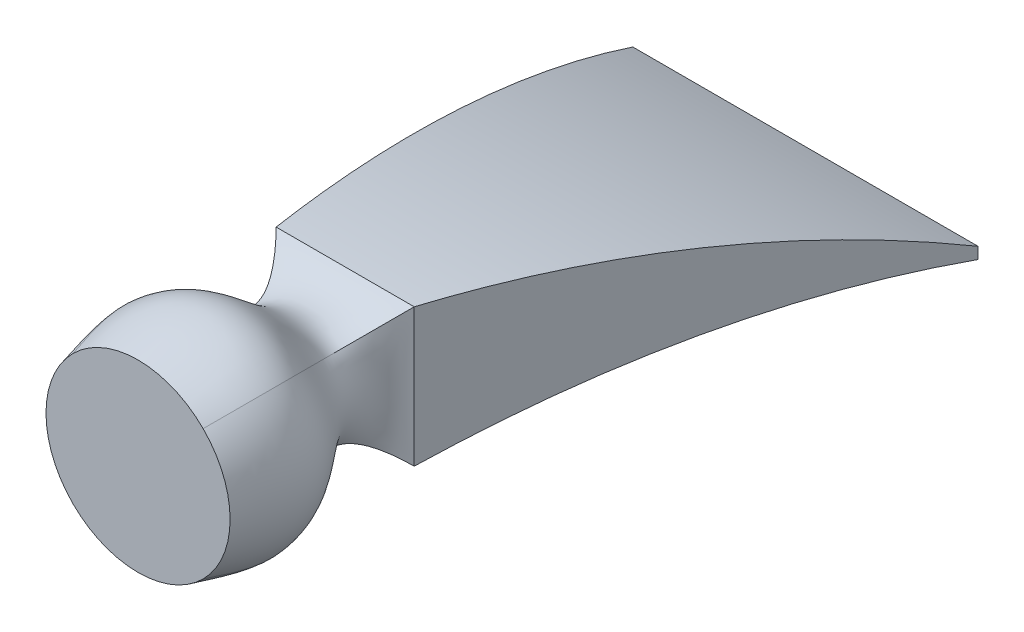
ISO-10303-21;
HEADER;
FILE_DESCRIPTION(('STEP AP214'),'2;1');
FILE_NAME('part.step','',(''),(''),'','','');
FILE_SCHEMA(('AUTOMOTIVE_DESIGN { 1 0 10303 214 1 1 1 1 }'));
ENDSEC;
DATA;
#1=APPLICATION_CONTEXT('core data for automotive mechanical design processes');
#2=APPLICATION_PROTOCOL_DEFINITION('international standard','automotive_design',2000,#1);
#3=PRODUCT_CONTEXT('',#1,'mechanical');
#4=PRODUCT('Part','Part','',(#3));
#5=PRODUCT_RELATED_PRODUCT_CATEGORY('part','',(#4));
#6=PRODUCT_DEFINITION_FORMATION('','',#4);
#7=PRODUCT_DEFINITION_CONTEXT('part definition',#1,'design');
#8=PRODUCT_DEFINITION('design','',#6,#7);
#9=PRODUCT_DEFINITION_SHAPE('','',#8);
#10=(LENGTH_UNIT() NAMED_UNIT(*) SI_UNIT(.MILLI.,.METRE.));
#11=(NAMED_UNIT(*) PLANE_ANGLE_UNIT() SI_UNIT($,.RADIAN.));
#12=(NAMED_UNIT(*) SI_UNIT($,.STERADIAN.) SOLID_ANGLE_UNIT());
#13=UNCERTAINTY_MEASURE_WITH_UNIT(LENGTH_MEASURE(1.E-05),#10,'distance_accuracy_value','');
#14=(GEOMETRIC_REPRESENTATION_CONTEXT(3) GLOBAL_UNCERTAINTY_ASSIGNED_CONTEXT((#13)) GLOBAL_UNIT_ASSIGNED_CONTEXT((#10,
#11,#12)) REPRESENTATION_CONTEXT('',''));
#15=CARTESIAN_POINT('',(0.,0.,0.));
#16=DIRECTION('',(0.,0.,1.));
#17=DIRECTION('',(1.,0.,0.));
#18=AXIS2_PLACEMENT_3D('',#15,#16,#17);
#19=CARTESIAN_POINT('',(0.,0.,304.8));
#20=DIRECTION('',(0.,0.,1.));
#21=DIRECTION('',(1.,0.,0.));
#22=AXIS2_PLACEMENT_3D('',#19,#20,#21);
#23=PLANE('',#22);
#24=CARTESIAN_POINT('',(0.,0.,304.8));
#25=DIRECTION('',(0.,0.,1.));
#26=DIRECTION('',(1.,0.,0.));
#27=AXIS2_PLACEMENT_3D('',#24,#25,#26);
#28=CIRCLE('',#27,12.);
#29=CARTESIAN_POINT('',(-8.48528137423857,-8.48528137423857,304.8));
#30=VERTEX_POINT('',#29);
#31=CARTESIAN_POINT('',(8.48528137423857,-8.48528137423857,304.8));
#32=VERTEX_POINT('',#31);
#33=EDGE_CURVE('E182',#30,#32,#28,.T.);
#34=ORIENTED_EDGE('',*,*,#33,.T.);
#35=CARTESIAN_POINT('',(8.48528137423857,8.48528137423857,304.8));
#36=VERTEX_POINT('',#35);
#37=EDGE_CURVE('E311',#32,#36,#28,.T.);
#38=ORIENTED_EDGE('',*,*,#37,.T.);
#39=CARTESIAN_POINT('',(-8.48528137423857,8.48528137423857,304.8));
#40=VERTEX_POINT('',#39);
#41=EDGE_CURVE('E315',#36,#40,#28,.T.);
#42=ORIENTED_EDGE('',*,*,#41,.T.);
#43=EDGE_CURVE('E303',#40,#30,#28,.T.);
#44=ORIENTED_EDGE('',*,*,#43,.T.);
#45=EDGE_LOOP('',(#34,#38,#42,#44));
#46=FACE_BOUND('',#45,.T.);
#47=ADVANCED_FACE('F154',(#46),#23,.T.);
#48=CARTESIAN_POINT('',(8.48528137423857,8.48528137423857,304.8));
#49=CARTESIAN_POINT('',(9.33473643066399,9.33473643066398,300.561235955056));
#50=CARTESIAN_POINT('',(10.8366753787183,10.8366753787183,293.175792141582));
#51=CARTESIAN_POINT('',(3.45394971686446,3.45394971686446,285.743392235397));
#52=CARTESIAN_POINT('',(6.56267301304578,6.56267301304578,280.274104100236));
#53=CARTESIAN_POINT('',(9.,9.,277.8));
#54=CARTESIAN_POINT('',(13.1684355281017,3.80212722037539,304.8));
#55=CARTESIAN_POINT('',(14.0178905845272,4.08527890585053,300.561235955056));
#56=CARTESIAN_POINT('',(16.2601868037866,4.73985693585621,293.175792141582));
#57=CARTESIAN_POINT('',(7.12312597179714,1.91419499843631,285.743392235397));
#58=CARTESIAN_POINT('',(6.56267301304578,2.18755767101526,280.274104100236));
#59=CARTESIAN_POINT('',(9.,3.,277.8));
#60=CARTESIAN_POINT('',(13.1684355281017,-3.8021272203754,304.8));
#61=CARTESIAN_POINT('',(14.0178905845272,-4.08527890585053,300.561235955056));
#62=CARTESIAN_POINT('',(16.2601868037866,-4.73985693585622,293.175792141582));
#63=CARTESIAN_POINT('',(7.12312597179714,-1.91419499843632,285.743392235397));
#64=CARTESIAN_POINT('',(6.56267301304578,-2.18755767101526,280.274104100236));
#65=CARTESIAN_POINT('',(9.,-3.,277.8));
#66=CARTESIAN_POINT('',(8.48528137423857,-8.48528137423857,304.8));
#67=CARTESIAN_POINT('',(9.33473643066398,-9.33473643066399,300.561235955056));
#68=CARTESIAN_POINT('',(10.8366753787183,-10.8366753787183,293.175792141582));
#69=CARTESIAN_POINT('',(3.45394971686446,-3.45394971686446,285.743392235397));
#70=CARTESIAN_POINT('',(6.56267301304578,-6.56267301304579,280.274104100236));
#71=CARTESIAN_POINT('',(9.,-9.,277.8));
#72=B_SPLINE_SURFACE_WITH_KNOTS('',3,3,((#48,#49,#50,#51,#52,#53),(#54,#55,#56,#57,#58,#59),
(#60,#61,#62,#63,#64,#65),(#66,#67,#68,#69,#70,#71)),.UNSPECIFIED.,.F.,.F.,.F.,(4,4),(4,1,1,4),
(0.,1.),(0.,0.408243982094371,0.714633261667619,1.),.UNSPECIFIED.);
#73=CARTESIAN_POINT('',(8.48528137423857,-8.48528137423857,304.8));
#74=CARTESIAN_POINT('',(9.33473643066398,-9.33473643066399,300.561235955056));
#75=CARTESIAN_POINT('',(10.8366753787183,-10.8366753787183,293.175792141582));
#76=CARTESIAN_POINT('',(3.45394971686446,-3.45394971686446,285.743392235397));
#77=CARTESIAN_POINT('',(6.56267301304578,-6.56267301304579,280.274104100236));
#78=CARTESIAN_POINT('',(9.,-9.,277.8));
#79=B_SPLINE_CURVE_WITH_KNOTS('',3,(#73,#74,#75,#76,#77,#78),.UNSPECIFIED.,.F.,.F.,(4,1,1,4),
(0.,0.408243982094371,0.714633261667619,1.),.UNSPECIFIED.);
#80=CARTESIAN_POINT('',(9.,-9.,277.8));
#81=VERTEX_POINT('',#80);
#82=EDGE_CURVE('E393',#32,#81,#79,.T.);
#83=DIRECTION('',(0.,1.,0.));
#84=VECTOR('',#83,1.);
#85=CARTESIAN_POINT('',(9.,-9.,277.8));
#86=LINE('',#85,#84);
#87=CARTESIAN_POINT('',(9.,9.,277.8));
#88=VERTEX_POINT('',#87);
#89=EDGE_CURVE('E219',#81,#88,#86,.T.);
#90=CARTESIAN_POINT('',(8.48528137423857,8.48528137423857,304.8));
#91=CARTESIAN_POINT('',(9.33473643066399,9.33473643066398,300.561235955056));
#92=CARTESIAN_POINT('',(10.8366753787183,10.8366753787183,293.175792141582));
#93=CARTESIAN_POINT('',(3.45394971686446,3.45394971686446,285.743392235397));
#94=CARTESIAN_POINT('',(6.56267301304578,6.56267301304578,280.274104100236));
#95=CARTESIAN_POINT('',(9.,9.,277.8));
#96=B_SPLINE_CURVE_WITH_KNOTS('',3,(#90,#91,#92,#93,#94,#95),.UNSPECIFIED.,.F.,.F.,(4,1,1,4),
(0.,0.408243982094371,0.714633261667619,1.),.UNSPECIFIED.);
#97=EDGE_CURVE('E380',#88,#36,#96,.F.);
#98=ORIENTED_EDGE('',*,*,#37,.F.);
#99=ORIENTED_EDGE('',*,*,#82,.T.);
#100=ORIENTED_EDGE('',*,*,#89,.T.);
#101=ORIENTED_EDGE('',*,*,#97,.T.);
#102=EDGE_LOOP('',(#98,#99,#100,#101));
#103=FACE_BOUND('',#102,.T.);
#104=ADVANCED_FACE('F333',(#103),#72,.T.);
#105=CARTESIAN_POINT('',(8.48528137423857,-8.48528137423857,304.8));
#106=CARTESIAN_POINT('',(9.33473643066399,-9.33473643066399,300.561235955056));
#107=CARTESIAN_POINT('',(10.8366753787183,-10.8366753787183,293.175792141582));
#108=CARTESIAN_POINT('',(3.45394971686446,-3.45394971686446,285.743392235397));
#109=CARTESIAN_POINT('',(6.56267301304578,-6.56267301304579,280.274104100236));
#110=CARTESIAN_POINT('',(9.,-9.,277.8));
#111=CARTESIAN_POINT('',(3.80212722037539,-13.1684355281017,304.8));
#112=CARTESIAN_POINT('',(4.08527890585053,-14.0178905845272,300.561235955056));
#113=CARTESIAN_POINT('',(4.73985693585622,-16.2601868037866,293.175792141582));
#114=CARTESIAN_POINT('',(1.91419499843631,-7.12312597179714,285.743392235397));
#115=CARTESIAN_POINT('',(2.18755767101526,-6.56267301304578,280.274104100236));
#116=CARTESIAN_POINT('',(3.,-9.,277.8));
#117=CARTESIAN_POINT('',(-3.80212722037539,-13.1684355281017,304.8));
#118=CARTESIAN_POINT('',(-4.08527890585053,-14.0178905845272,300.561235955056));
#119=CARTESIAN_POINT('',(-4.73985693585622,-16.2601868037866,293.175792141582));
#120=CARTESIAN_POINT('',(-1.91419499843632,-7.12312597179714,285.743392235397));
#121=CARTESIAN_POINT('',(-2.18755767101526,-6.56267301304578,280.274104100236));
#122=CARTESIAN_POINT('',(-3.,-9.,277.8));
#123=CARTESIAN_POINT('',(-8.48528137423857,-8.48528137423857,304.8));
#124=CARTESIAN_POINT('',(-9.33473643066399,-9.33473643066399,300.561235955056));
#125=CARTESIAN_POINT('',(-10.8366753787183,-10.8366753787183,293.175792141582));
#126=CARTESIAN_POINT('',(-3.45394971686446,-3.45394971686446,285.743392235397));
#127=CARTESIAN_POINT('',(-6.56267301304578,-6.56267301304578,280.274104100236));
#128=CARTESIAN_POINT('',(-9.,-9.,277.8));
#129=B_SPLINE_SURFACE_WITH_KNOTS('',3,3,((#105,#106,#107,#108,#109,#110),(#111,#112,#113,#114,
#115,#116),(#117,#118,#119,#120,#121,#122),(#123,#124,#125,#126,#127,#128)),.UNSPECIFIED.,.F.,
.F.,.F.,(4,4),(4,1,1,4),(0.,1.),(0.,0.408243982094371,0.714633261667619,1.),.UNSPECIFIED.);
#130=CARTESIAN_POINT('',(-8.48528137423857,-8.48528137423857,304.8));
#131=CARTESIAN_POINT('',(-9.33473643066399,-9.33473643066399,300.561235955056));
#132=CARTESIAN_POINT('',(-10.8366753787183,-10.8366753787183,293.175792141582));
#133=CARTESIAN_POINT('',(-3.45394971686446,-3.45394971686446,285.743392235397));
#134=CARTESIAN_POINT('',(-6.56267301304578,-6.56267301304578,280.274104100236));
#135=CARTESIAN_POINT('',(-9.,-9.,277.8));
#136=B_SPLINE_CURVE_WITH_KNOTS('',3,(#130,#131,#132,#133,#134,#135),.UNSPECIFIED.,.F.,.F.,(4,1,
1,4),(0.,0.408243982094371,0.714633261667619,1.),.UNSPECIFIED.);
#137=CARTESIAN_POINT('',(-9.,-9.,277.8));
#138=VERTEX_POINT('',#137);
#139=EDGE_CURVE('E389',#30,#138,#136,.T.);
#140=DIRECTION('',(1.,0.,0.));
#141=VECTOR('',#140,1.);
#142=CARTESIAN_POINT('',(-9.,-9.,277.8));
#143=LINE('',#142,#141);
#144=EDGE_CURVE('E360',#138,#81,#143,.T.);
#145=ORIENTED_EDGE('',*,*,#33,.F.);
#146=ORIENTED_EDGE('',*,*,#139,.T.);
#147=ORIENTED_EDGE('',*,*,#144,.T.);
#148=ORIENTED_EDGE('',*,*,#82,.F.);
#149=EDGE_LOOP('',(#145,#146,#147,#148));
#150=FACE_BOUND('',#149,.T.);
#151=ADVANCED_FACE('F442',(#150),#129,.T.);
#152=CARTESIAN_POINT('',(-8.48528137423857,8.48528137423857,304.8));
#153=CARTESIAN_POINT('',(-9.33473643066398,9.33473643066399,300.561235955056));
#154=CARTESIAN_POINT('',(-10.8366753787183,10.8366753787183,293.175792141582));
#155=CARTESIAN_POINT('',(-3.45394971686446,3.45394971686446,285.743392235397));
#156=CARTESIAN_POINT('',(-6.56267301304578,6.56267301304578,280.274104100236));
#157=CARTESIAN_POINT('',(-9.,9.,277.8));
#158=CARTESIAN_POINT('',(-3.80212722037539,13.1684355281017,304.8));
#159=CARTESIAN_POINT('',(-4.08527890585053,14.0178905845272,300.561235955056));
#160=CARTESIAN_POINT('',(-4.73985693585621,16.2601868037866,293.175792141582));
#161=CARTESIAN_POINT('',(-1.91419499843631,7.12312597179714,285.743392235397));
#162=CARTESIAN_POINT('',(-2.18755767101526,6.56267301304578,280.274104100236));
#163=CARTESIAN_POINT('',(-3.,9.,277.8));
#164=CARTESIAN_POINT('',(3.80212722037539,13.1684355281017,304.8));
#165=CARTESIAN_POINT('',(4.08527890585053,14.0178905845272,300.561235955056));
#166=CARTESIAN_POINT('',(4.73985693585621,16.2601868037866,293.175792141582));
#167=CARTESIAN_POINT('',(1.91419499843631,7.12312597179714,285.743392235397));
#168=CARTESIAN_POINT('',(2.18755767101526,6.56267301304579,280.274104100236));
#169=CARTESIAN_POINT('',(3.,9.,277.8));
#170=CARTESIAN_POINT('',(8.48528137423857,8.48528137423857,304.8));
#171=CARTESIAN_POINT('',(9.33473643066398,9.33473643066399,300.561235955056));
#172=CARTESIAN_POINT('',(10.8366753787183,10.8366753787183,293.175792141582));
#173=CARTESIAN_POINT('',(3.45394971686446,3.45394971686446,285.743392235397));
#174=CARTESIAN_POINT('',(6.56267301304578,6.56267301304579,280.274104100236));
#175=CARTESIAN_POINT('',(9.,9.,277.8));
#176=B_SPLINE_SURFACE_WITH_KNOTS('',3,3,((#152,#153,#154,#155,#156,#157),(#158,#159,#160,#161,
#162,#163),(#164,#165,#166,#167,#168,#169),(#170,#171,#172,#173,#174,#175)),.UNSPECIFIED.,.F.,
.F.,.F.,(4,4),(4,1,1,4),(0.,1.),(0.,0.408243982094371,0.714633261667619,1.),.UNSPECIFIED.);
#177=DIRECTION('',(-1.,0.,0.));
#178=VECTOR('',#177,1.);
#179=CARTESIAN_POINT('',(9.,9.,277.8));
#180=LINE('',#179,#178);
#181=CARTESIAN_POINT('',(-9.,9.,277.8));
#182=VERTEX_POINT('',#181);
#183=EDGE_CURVE('E161',#88,#182,#180,.T.);
#184=CARTESIAN_POINT('',(-8.48528137423857,8.48528137423857,304.8));
#185=CARTESIAN_POINT('',(-9.33473643066399,9.33473643066399,300.561235955056));
#186=CARTESIAN_POINT('',(-10.8366753787183,10.8366753787183,293.175792141582));
#187=CARTESIAN_POINT('',(-3.45394971686446,3.45394971686446,285.743392235397));
#188=CARTESIAN_POINT('',(-6.56267301304578,6.56267301304578,280.274104100236));
#189=CARTESIAN_POINT('',(-9.,9.,277.8));
#190=B_SPLINE_CURVE_WITH_KNOTS('',3,(#184,#185,#186,#187,#188,#189),.UNSPECIFIED.,.F.,.F.,(4,1,
1,4),(0.,0.408243982094371,0.714633261667619,1.),.UNSPECIFIED.);
#191=EDGE_CURVE('E363',#40,#182,#190,.T.);
#192=ORIENTED_EDGE('',*,*,#41,.F.);
#193=ORIENTED_EDGE('',*,*,#97,.F.);
#194=ORIENTED_EDGE('',*,*,#183,.T.);
#195=ORIENTED_EDGE('',*,*,#191,.F.);
#196=EDGE_LOOP('',(#192,#193,#194,#195));
#197=FACE_BOUND('',#196,.T.);
#198=ADVANCED_FACE('F379',(#197),#176,.T.);
#199=CARTESIAN_POINT('',(-8.48528137423857,-8.48528137423857,304.8));
#200=CARTESIAN_POINT('',(-9.33473643066399,-9.33473643066399,300.561235955056));
#201=CARTESIAN_POINT('',(-10.8366753787183,-10.8366753787183,293.175792141582));
#202=CARTESIAN_POINT('',(-3.45394971686446,-3.45394971686446,285.743392235397));
#203=CARTESIAN_POINT('',(-6.56267301304578,-6.56267301304578,280.274104100236));
#204=CARTESIAN_POINT('',(-9.,-9.,277.8));
#205=CARTESIAN_POINT('',(-13.1684355281017,-3.80212722037539,304.8));
#206=CARTESIAN_POINT('',(-14.0178905845272,-4.08527890585053,300.561235955056));
#207=CARTESIAN_POINT('',(-16.2601868037866,-4.73985693585622,293.175792141582));
#208=CARTESIAN_POINT('',(-7.12312597179714,-1.91419499843631,285.743392235397));
#209=CARTESIAN_POINT('',(-6.56267301304578,-2.18755767101526,280.274104100236));
#210=CARTESIAN_POINT('',(-9.,-3.,277.8));
#211=CARTESIAN_POINT('',(-13.1684355281017,3.80212722037539,304.8));
#212=CARTESIAN_POINT('',(-14.0178905845272,4.08527890585053,300.561235955056));
#213=CARTESIAN_POINT('',(-16.2601868037866,4.73985693585622,293.175792141582));
#214=CARTESIAN_POINT('',(-7.12312597179714,1.91419499843631,285.743392235397));
#215=CARTESIAN_POINT('',(-6.56267301304578,2.18755767101526,280.274104100236));
#216=CARTESIAN_POINT('',(-9.,3.,277.8));
#217=CARTESIAN_POINT('',(-8.48528137423857,8.48528137423857,304.8));
#218=CARTESIAN_POINT('',(-9.33473643066399,9.33473643066399,300.561235955056));
#219=CARTESIAN_POINT('',(-10.8366753787183,10.8366753787183,293.175792141582));
#220=CARTESIAN_POINT('',(-3.45394971686446,3.45394971686446,285.743392235397));
#221=CARTESIAN_POINT('',(-6.56267301304578,6.56267301304578,280.274104100236));
#222=CARTESIAN_POINT('',(-9.,9.,277.8));
#223=B_SPLINE_SURFACE_WITH_KNOTS('',3,3,((#199,#200,#201,#202,#203,#204),(#205,#206,#207,#208,
#209,#210),(#211,#212,#213,#214,#215,#216),(#217,#218,#219,#220,#221,#222)),.UNSPECIFIED.,.F.,
.F.,.F.,(4,4),(4,1,1,4),(0.,1.),(0.,0.408243982094371,0.714633261667619,1.),.UNSPECIFIED.);
#224=DIRECTION('',(0.,-1.,0.));
#225=VECTOR('',#224,1.);
#226=CARTESIAN_POINT('',(-9.,9.,277.8));
#227=LINE('',#226,#225);
#228=EDGE_CURVE('E13',#182,#138,#227,.T.);
#229=ORIENTED_EDGE('',*,*,#43,.F.);
#230=ORIENTED_EDGE('',*,*,#191,.T.);
#231=ORIENTED_EDGE('',*,*,#228,.T.);
#232=ORIENTED_EDGE('',*,*,#139,.F.);
#233=EDGE_LOOP('',(#229,#230,#231,#232));
#234=FACE_BOUND('',#233,.T.);
#235=ADVANCED_FACE('F156',(#234),#223,.T.);
#236=CARTESIAN_POINT('',(0.,0.,217.8));
#237=DIRECTION('',(0.,0.,1.));
#238=DIRECTION('',(1.,0.,0.));
#239=AXIS2_PLACEMENT_3D('',#236,#237,#238);
#240=PLANE('',#239);
#241=DIRECTION('',(0.,-1.,0.));
#242=VECTOR('',#241,1.);
#243=CARTESIAN_POINT('',(-22.5,-8.91695272600236,217.8));
#244=LINE('',#243,#242);
#245=CARTESIAN_POINT('',(-22.5,-7.41695272600237,217.8));
#246=VERTEX_POINT('',#245);
#247=CARTESIAN_POINT('',(-22.5,-8.91695272600236,217.8));
#248=VERTEX_POINT('',#247);
#249=EDGE_CURVE('E286',#246,#248,#244,.T.);
#250=ORIENTED_EDGE('',*,*,#249,.F.);
#251=DIRECTION('',(-1.,0.,0.));
#252=VECTOR('',#251,1.);
#253=CARTESIAN_POINT('',(22.5,-7.41695272600237,217.8));
#254=LINE('',#253,#252);
#255=CARTESIAN_POINT('',(22.5,-7.41695272600237,217.8));
#256=VERTEX_POINT('',#255);
#257=EDGE_CURVE('E241',#256,#246,#254,.T.);
#258=ORIENTED_EDGE('',*,*,#257,.F.);
#259=DIRECTION('',(0.,1.,0.));
#260=VECTOR('',#259,1.);
#261=CARTESIAN_POINT('',(22.5,-8.91695272600236,217.8));
#262=LINE('',#261,#260);
#263=CARTESIAN_POINT('',(22.5,-8.91695272600236,217.8));
#264=VERTEX_POINT('',#263);
#265=EDGE_CURVE('E216',#264,#256,#262,.T.);
#266=ORIENTED_EDGE('',*,*,#265,.F.);
#267=DIRECTION('',(1.,0.,0.));
#268=VECTOR('',#267,1.);
#269=CARTESIAN_POINT('',(22.5,-8.91695272600236,217.8));
#270=LINE('',#269,#268);
#271=EDGE_CURVE('E227',#248,#264,#270,.T.);
#272=ORIENTED_EDGE('',*,*,#271,.F.);
#273=EDGE_LOOP('',(#250,#258,#266,#272));
#274=FACE_BOUND('',#273,.T.);
#275=ADVANCED_FACE('F240',(#274),#240,.F.);
#276=CARTESIAN_POINT('',(22.5,-7.41695272600237,217.8));
#277=CARTESIAN_POINT('',(18.,1.80997133034949,236.578191281649));
#278=CARTESIAN_POINT('',(13.5,7.38130633141296,256.940076074943));
#279=CARTESIAN_POINT('',(9.,9.,277.8));
#280=CARTESIAN_POINT('',(21.3407643312102,-7.41695272600237,217.8));
#281=CARTESIAN_POINT('',(16.7924628450106,1.80997133034949,236.578191281649));
#282=CARTESIAN_POINT('',(12.244161358811,7.38130633141296,256.940076074943));
#283=CARTESIAN_POINT('',(7.69585987261146,9.,277.8));
#284=CARTESIAN_POINT('',(18.7360053091577,-7.41695272600237,217.8));
#285=CARTESIAN_POINT('',(14.5484501698754,1.80997133034949,236.578191281649));
#286=CARTESIAN_POINT('',(10.3608950305931,7.38130633141296,256.940076074943));
#287=CARTESIAN_POINT('',(6.17333989131079,9.,277.8));
#288=CARTESIAN_POINT('',(13.5873099221581,-7.41695272600237,217.8));
#289=CARTESIAN_POINT('',(10.3987727311159,1.80997133034949,236.57819128165));
#290=CARTESIAN_POINT('',(7.21023554007361,7.38130633141295,256.940076074943));
#291=CARTESIAN_POINT('',(4.02169834903135,8.99999999999999,277.8));
#292=CARTESIAN_POINT('',(6.35199041152679,-7.41695272600238,217.8));
#293=CARTESIAN_POINT('',(4.94218890537627,1.80997133034949,236.578191281649));
#294=CARTESIAN_POINT('',(3.53238739922575,7.38130633141296,256.940076074943));
#295=CARTESIAN_POINT('',(2.12258589307524,9.00000000000001,277.8));
#296=CARTESIAN_POINT('',(1.87500000000001,-7.41695272600237,217.8));
#297=CARTESIAN_POINT('',(1.5,1.80997133034949,236.578191281649));
#298=CARTESIAN_POINT('',(1.125,7.38130633141296,256.940076074943));
#299=CARTESIAN_POINT('',(0.75,9.,277.8));
#300=CARTESIAN_POINT('',(-1.87499999999999,-7.41695272600237,217.8));
#301=CARTESIAN_POINT('',(-1.5,1.80997133034949,236.578191281649));
#302=CARTESIAN_POINT('',(-1.125,7.38130633141296,256.940076074943));
#303=CARTESIAN_POINT('',(-0.75,9.,277.8));
#304=CARTESIAN_POINT('',(-6.35199041152675,-7.41695272600237,217.8));
#305=CARTESIAN_POINT('',(-4.94218890537625,1.80997133034949,236.578191281649));
#306=CARTESIAN_POINT('',(-3.53238739922575,7.38130633141295,256.940076074943));
#307=CARTESIAN_POINT('',(-2.12258589307524,8.99999999999999,277.8));
#308=CARTESIAN_POINT('',(-13.5873099221581,-7.41695272600237,217.8));
#309=CARTESIAN_POINT('',(-10.3987727311159,1.80997133034949,236.578191281649));
#310=CARTESIAN_POINT('',(-7.21023554007362,7.38130633141296,256.940076074943));
#311=CARTESIAN_POINT('',(-4.02169834903135,9.00000000000001,277.8));
#312=CARTESIAN_POINT('',(-18.7360053091577,-7.41695272600237,217.8));
#313=CARTESIAN_POINT('',(-14.5484501698754,1.80997133034949,236.578191281649));
#314=CARTESIAN_POINT('',(-10.3608950305931,7.38130633141296,256.940076074943));
#315=CARTESIAN_POINT('',(-6.1733398913108,9.,277.8));
#316=CARTESIAN_POINT('',(-21.3407643312102,-7.41695272600237,217.8));
#317=CARTESIAN_POINT('',(-16.7924628450106,1.80997133034949,236.578191281649));
#318=CARTESIAN_POINT('',(-12.244161358811,7.38130633141296,256.940076074943));
#319=CARTESIAN_POINT('',(-7.69585987261146,9.,277.8));
#320=CARTESIAN_POINT('',(-22.5,-7.41695272600237,217.8));
#321=CARTESIAN_POINT('',(-18.,1.80997133034949,236.578191281649));
#322=CARTESIAN_POINT('',(-13.5,7.38130633141296,256.940076074943));
#323=CARTESIAN_POINT('',(-9.,9.,277.8));
#324=B_SPLINE_SURFACE_WITH_KNOTS('',3,3,((#276,#277,#278,#279),(#280,#281,#282,#283),(#284,#285,
#286,#287),(#288,#289,#290,#291),(#292,#293,#294,#295),(#296,#297,#298,#299),(#300,#301,#302,
#303),(#304,#305,#306,#307),(#308,#309,#310,#311),(#312,#313,#314,#315),(#316,#317,#318,#319),
(#320,#321,#322,#323)),.UNSPECIFIED.,.F.,.F.,.F.,(4,1,1,1,2,1,1,1,4),(4,4),(0.633064516129032,
0.678931451612903,0.724798387096774,0.770665322580645,0.816532258064516,0.862399193548387,
0.908266129032258,0.954133064516129,1.),(0.,1.),.UNSPECIFIED.);
#325=CARTESIAN_POINT('',(-22.5,-7.41695272600237,217.8));
#326=CARTESIAN_POINT('',(-18.,1.80997133034949,236.578191281649));
#327=CARTESIAN_POINT('',(-13.5,7.38130633141296,256.940076074943));
#328=CARTESIAN_POINT('',(-9.,9.,277.8));
#329=B_SPLINE_CURVE_WITH_KNOTS('',3,(#325,#326,#327,#328),.UNSPECIFIED.,.F.,.F.,(4,4),(0.,1.),.UNSPECIFIED.);
#330=EDGE_CURVE('E488',#246,#182,#329,.T.);
#331=CARTESIAN_POINT('',(22.5,-7.41695272600237,217.8));
#332=CARTESIAN_POINT('',(18.,1.80997133034949,236.578191281649));
#333=CARTESIAN_POINT('',(13.5,7.38130633141296,256.940076074943));
#334=CARTESIAN_POINT('',(9.,9.,277.8));
#335=B_SPLINE_CURVE_WITH_KNOTS('',3,(#331,#332,#333,#334),.UNSPECIFIED.,.F.,.F.,(4,4),(0.,1.),.UNSPECIFIED.);
#336=EDGE_CURVE('E174',#256,#88,#335,.T.);
#337=ORIENTED_EDGE('',*,*,#257,.T.);
#338=ORIENTED_EDGE('',*,*,#330,.T.);
#339=ORIENTED_EDGE('',*,*,#183,.F.);
#340=ORIENTED_EDGE('',*,*,#336,.F.);
#341=EDGE_LOOP('',(#337,#338,#339,#340));
#342=FACE_BOUND('',#341,.T.);
#343=ADVANCED_FACE('F261',(#342),#324,.T.);
#344=CARTESIAN_POINT('',(22.5,-8.91695272600236,217.8));
#345=CARTESIAN_POINT('',(18.,-5.19002866965051,236.578191281649));
#346=CARTESIAN_POINT('',(13.5,-5.11869366858704,256.940076074943));
#347=CARTESIAN_POINT('',(9.,-9.,277.8));
#348=CARTESIAN_POINT('',(22.5,-8.79195272600236,217.8));
#349=CARTESIAN_POINT('',(18.,-4.60669533631717,236.578191281649));
#350=CARTESIAN_POINT('',(13.5,-4.07702700192038,256.940076074943));
#351=CARTESIAN_POINT('',(9.,-7.5,277.8));
#352=CARTESIAN_POINT('',(22.5,-8.54195272600237,217.8));
#353=CARTESIAN_POINT('',(18.,-3.44002866965051,236.578191281649));
#354=CARTESIAN_POINT('',(13.5,-1.99369366858705,256.940076074943));
#355=CARTESIAN_POINT('',(9.,-4.5,277.8));
#356=CARTESIAN_POINT('',(22.5,-8.16695272600236,217.8));
#357=CARTESIAN_POINT('',(18.,-1.69002866965051,236.578191281649));
#358=CARTESIAN_POINT('',(13.5,1.13130633141295,256.940076074943));
#359=CARTESIAN_POINT('',(9.,0.,277.8));
#360=CARTESIAN_POINT('',(22.5,-7.79195272600238,217.8));
#361=CARTESIAN_POINT('',(18.,0.0599713303494841,236.57819128165));
#362=CARTESIAN_POINT('',(13.5,4.25630633141295,256.940076074943));
#363=CARTESIAN_POINT('',(9.,4.5,277.8));
#364=CARTESIAN_POINT('',(22.5,-7.54195272600237,217.8));
#365=CARTESIAN_POINT('',(18.,1.22663799701616,236.578191281649));
#366=CARTESIAN_POINT('',(13.5,6.33963966474629,256.940076074943));
#367=CARTESIAN_POINT('',(9.,7.5,277.8));
#368=CARTESIAN_POINT('',(22.5,-7.41695272600237,217.8));
#369=CARTESIAN_POINT('',(18.,1.80997133034949,236.578191281649));
#370=CARTESIAN_POINT('',(13.5,7.38130633141296,256.940076074943));
#371=CARTESIAN_POINT('',(9.,9.,277.8));
#372=B_SPLINE_SURFACE_WITH_KNOTS('',3,3,((#344,#345,#346,#347),(#348,#349,#350,#351),(#352,#353,
#354,#355),(#356,#357,#358,#359),(#360,#361,#362,#363),(#364,#365,#366,#367),(#368,#369,#370,
#371)),.UNSPECIFIED.,.F.,.F.,.F.,(4,1,1,1,4),(4,4),(0.5,0.533266129032258,0.566532258064516,
0.599798387096774,0.633064516129032),(0.,1.),.UNSPECIFIED.);
#373=CARTESIAN_POINT('',(22.5,-8.91695272600236,217.8));
#374=CARTESIAN_POINT('',(18.,-5.19002866965051,236.578191281649));
#375=CARTESIAN_POINT('',(13.5,-5.11869366858704,256.940076074943));
#376=CARTESIAN_POINT('',(9.,-9.,277.8));
#377=B_SPLINE_CURVE_WITH_KNOTS('',3,(#373,#374,#375,#376),.UNSPECIFIED.,.F.,.F.,(4,4),(0.,1.),.UNSPECIFIED.);
#378=EDGE_CURVE('E212',#264,#81,#377,.T.);
#379=ORIENTED_EDGE('',*,*,#265,.T.);
#380=ORIENTED_EDGE('',*,*,#336,.T.);
#381=ORIENTED_EDGE('',*,*,#89,.F.);
#382=ORIENTED_EDGE('',*,*,#378,.F.);
#383=EDGE_LOOP('',(#379,#380,#381,#382));
#384=FACE_BOUND('',#383,.T.);
#385=ADVANCED_FACE('F214',(#384),#372,.T.);
#386=CARTESIAN_POINT('',(-22.5,-8.91695272600236,217.8));
#387=CARTESIAN_POINT('',(-18.,-5.19002866965051,236.578191281649));
#388=CARTESIAN_POINT('',(-13.5,-5.11869366858704,256.940076074943));
#389=CARTESIAN_POINT('',(-9.,-9.,277.8));
#390=CARTESIAN_POINT('',(-18.75,-8.91695272600236,217.8));
#391=CARTESIAN_POINT('',(-15.,-5.19002866965051,236.578191281649));
#392=CARTESIAN_POINT('',(-11.25,-5.11869366858704,256.940076074943));
#393=CARTESIAN_POINT('',(-7.5,-9.,277.8));
#394=CARTESIAN_POINT('',(-11.25,-8.91695272600237,217.8));
#395=CARTESIAN_POINT('',(-8.99999999999999,-5.1900286696505,236.578191281649));
#396=CARTESIAN_POINT('',(-6.75,-5.11869366858703,256.940076074943));
#397=CARTESIAN_POINT('',(-4.5,-8.99999999999999,277.8));
#398=CARTESIAN_POINT('',(0.,-8.91695272600236,217.8));
#399=CARTESIAN_POINT('',(0.,-5.19002866965051,236.578191281649));
#400=CARTESIAN_POINT('',(0.,-5.11869366858705,256.940076074943));
#401=CARTESIAN_POINT('',(0.,-9.00000000000002,277.8));
#402=CARTESIAN_POINT('',(11.25,-8.91695272600237,217.8));
#403=CARTESIAN_POINT('',(9.,-5.1900286696505,236.578191281649));
#404=CARTESIAN_POINT('',(6.75,-5.11869366858703,256.940076074943));
#405=CARTESIAN_POINT('',(4.5,-8.99999999999998,277.8));
#406=CARTESIAN_POINT('',(18.75,-8.91695272600236,217.8));
#407=CARTESIAN_POINT('',(15.,-5.19002866965051,236.578191281649));
#408=CARTESIAN_POINT('',(11.25,-5.11869366858704,256.940076074943));
#409=CARTESIAN_POINT('',(7.5,-9.,277.8));
#410=CARTESIAN_POINT('',(22.5,-8.91695272600236,217.8));
#411=CARTESIAN_POINT('',(18.,-5.19002866965051,236.578191281649));
#412=CARTESIAN_POINT('',(13.5,-5.11869366858704,256.940076074943));
#413=CARTESIAN_POINT('',(9.,-9.,277.8));
#414=B_SPLINE_SURFACE_WITH_KNOTS('',3,3,((#386,#387,#388,#389),(#390,#391,#392,#393),(#394,#395,
#396,#397),(#398,#399,#400,#401),(#402,#403,#404,#405),(#406,#407,#408,#409),(#410,#411,#412,
#413)),.UNSPECIFIED.,.F.,.F.,.F.,(4,1,1,1,4),(4,4),(0.133064516129032,0.224798387096774,
0.316532258064516,0.408266129032258,0.5),(0.,1.),.UNSPECIFIED.);
#415=CARTESIAN_POINT('',(-22.5,-8.91695272600236,217.8));
#416=CARTESIAN_POINT('',(-18.,-5.19002866965051,236.578191281649));
#417=CARTESIAN_POINT('',(-13.5,-5.11869366858704,256.940076074943));
#418=CARTESIAN_POINT('',(-9.,-9.,277.8));
#419=B_SPLINE_CURVE_WITH_KNOTS('',3,(#415,#416,#417,#418),.UNSPECIFIED.,.F.,.F.,(4,4),(0.,1.),.UNSPECIFIED.);
#420=EDGE_CURVE('E224',#248,#138,#419,.T.);
#421=ORIENTED_EDGE('',*,*,#271,.T.);
#422=ORIENTED_EDGE('',*,*,#378,.T.);
#423=ORIENTED_EDGE('',*,*,#144,.F.);
#424=ORIENTED_EDGE('',*,*,#420,.F.);
#425=EDGE_LOOP('',(#421,#422,#423,#424));
#426=FACE_BOUND('',#425,.T.);
#427=ADVANCED_FACE('F229',(#426),#414,.T.);
#428=CARTESIAN_POINT('',(-22.5,-7.41695272600237,217.8));
#429=CARTESIAN_POINT('',(-18.,1.80997133034949,236.578191281649));
#430=CARTESIAN_POINT('',(-13.5,7.38130633141296,256.940076074943));
#431=CARTESIAN_POINT('',(-9.,9.,277.8));
#432=CARTESIAN_POINT('',(-22.5,-7.54195272600237,217.8));
#433=CARTESIAN_POINT('',(-18.,1.22663799701616,236.578191281649));
#434=CARTESIAN_POINT('',(-13.5,6.33963966474629,256.940076074943));
#435=CARTESIAN_POINT('',(-8.99999999999999,7.5,277.8));
#436=CARTESIAN_POINT('',(-22.5,-7.79195272600237,217.8));
#437=CARTESIAN_POINT('',(-18.,0.0599713303494876,236.578191281649));
#438=CARTESIAN_POINT('',(-13.5,4.25630633141296,256.940076074943));
#439=CARTESIAN_POINT('',(-9.,4.5,277.8));
#440=CARTESIAN_POINT('',(-22.5,-8.16695272600236,217.8));
#441=CARTESIAN_POINT('',(-18.,-1.6900286696505,236.578191281649));
#442=CARTESIAN_POINT('',(-13.5,1.13130633141296,256.940076074943));
#443=CARTESIAN_POINT('',(-9.,0.,277.8));
#444=CARTESIAN_POINT('',(-22.5,-8.54195272600237,217.8));
#445=CARTESIAN_POINT('',(-18.,-3.44002866965051,236.578191281649));
#446=CARTESIAN_POINT('',(-13.5,-1.99369366858704,256.940076074943));
#447=CARTESIAN_POINT('',(-8.99999999999999,-4.5,277.8));
#448=CARTESIAN_POINT('',(-22.5,-8.79195272600236,217.8));
#449=CARTESIAN_POINT('',(-18.,-4.60669533631717,236.578191281649));
#450=CARTESIAN_POINT('',(-13.5,-4.07702700192037,256.940076074943));
#451=CARTESIAN_POINT('',(-8.99999999999999,-7.5,277.8));
#452=CARTESIAN_POINT('',(-22.5,-8.91695272600236,217.8));
#453=CARTESIAN_POINT('',(-18.,-5.19002866965051,236.578191281649));
#454=CARTESIAN_POINT('',(-13.5,-5.11869366858704,256.940076074943));
#455=CARTESIAN_POINT('',(-9.,-9.,277.8));
#456=B_SPLINE_SURFACE_WITH_KNOTS('',3,3,((#428,#429,#430,#431),(#432,#433,#434,#435),(#436,#437,
#438,#439),(#440,#441,#442,#443),(#444,#445,#446,#447),(#448,#449,#450,#451),(#452,#453,#454,
#455)),.UNSPECIFIED.,.F.,.F.,.F.,(4,1,1,1,4),(4,4),(0.,0.033266129032258,0.066532258064516,
0.0997983870967742,0.133064516129032),(0.,1.),.UNSPECIFIED.);
#457=ORIENTED_EDGE('',*,*,#249,.T.);
#458=ORIENTED_EDGE('',*,*,#420,.T.);
#459=ORIENTED_EDGE('',*,*,#228,.F.);
#460=ORIENTED_EDGE('',*,*,#330,.F.);
#461=EDGE_LOOP('',(#457,#458,#459,#460));
#462=FACE_BOUND('',#461,.T.);
#463=ADVANCED_FACE('F262',(#462),#456,.T.);
#464=CLOSED_SHELL('',(#47,#104,#151,#198,#235,#275,#343,#385,#427,#463));
#465=MANIFOLD_SOLID_BREP('B2',#464);
#466=ADVANCED_BREP_SHAPE_REPRESENTATION('',(#18,#465),#14);
#467=SHAPE_DEFINITION_REPRESENTATION(#9,#466);
ENDSEC;
END-ISO-10303-21;
